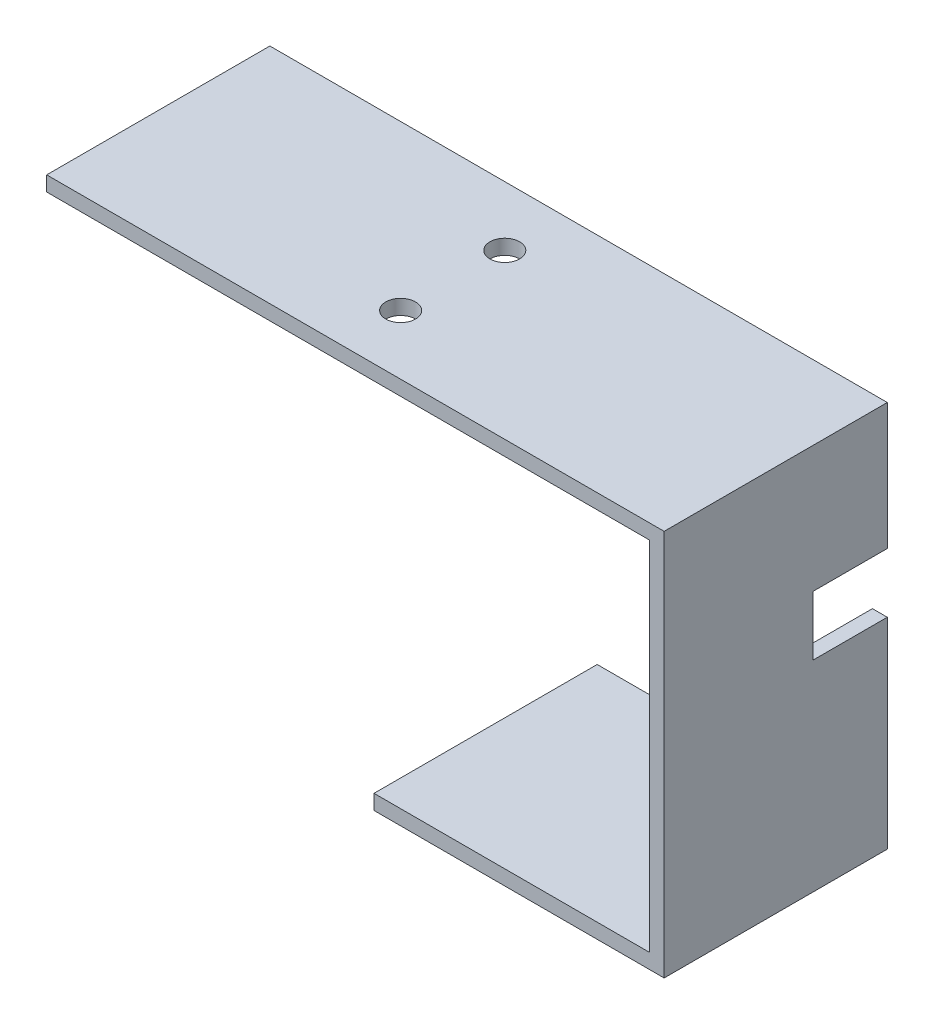
ISO-10303-21;
HEADER;
FILE_DESCRIPTION(('STEP AP214'),'2;1');
FILE_NAME('part.step','',(''),(''),'','','');
FILE_SCHEMA(('AUTOMOTIVE_DESIGN { 1 0 10303 214 1 1 1 1 }'));
ENDSEC;
DATA;
#1=APPLICATION_CONTEXT('core data for automotive mechanical design processes');
#2=APPLICATION_PROTOCOL_DEFINITION('international standard','automotive_design',2000,#1);
#3=PRODUCT_CONTEXT('',#1,'mechanical');
#4=PRODUCT('Part','Part','',(#3));
#5=PRODUCT_RELATED_PRODUCT_CATEGORY('part','',(#4));
#6=PRODUCT_DEFINITION_FORMATION('','',#4);
#7=PRODUCT_DEFINITION_CONTEXT('part definition',#1,'design');
#8=PRODUCT_DEFINITION('design','',#6,#7);
#9=PRODUCT_DEFINITION_SHAPE('','',#8);
#10=(LENGTH_UNIT() NAMED_UNIT(*) SI_UNIT(.MILLI.,.METRE.));
#11=(NAMED_UNIT(*) PLANE_ANGLE_UNIT() SI_UNIT($,.RADIAN.));
#12=(NAMED_UNIT(*) SI_UNIT($,.STERADIAN.) SOLID_ANGLE_UNIT());
#13=UNCERTAINTY_MEASURE_WITH_UNIT(LENGTH_MEASURE(1.E-05),#10,'distance_accuracy_value','');
#14=(GEOMETRIC_REPRESENTATION_CONTEXT(3) GLOBAL_UNCERTAINTY_ASSIGNED_CONTEXT((#13)) GLOBAL_UNIT_ASSIGNED_CONTEXT((#10,
#11,#12)) REPRESENTATION_CONTEXT('',''));
#15=CARTESIAN_POINT('',(0.,0.,0.));
#16=DIRECTION('',(0.,0.,1.));
#17=DIRECTION('',(1.,0.,0.));
#18=AXIS2_PLACEMENT_3D('',#15,#16,#17);
#19=CARTESIAN_POINT('',(0.,0.,0.));
#20=DIRECTION('',(0.,0.,-1.));
#21=DIRECTION('',(-1.,0.,0.));
#22=AXIS2_PLACEMENT_3D('',#19,#20,#21);
#23=PLANE('',#22);
#24=DIRECTION('',(-1.,0.,0.));
#25=VECTOR('',#24,1.);
#26=CARTESIAN_POINT('',(0.,-23.,0.));
#27=LINE('',#26,#25);
#28=CARTESIAN_POINT('',(2.,-23.,0.));
#29=VERTEX_POINT('',#28);
#30=CARTESIAN_POINT('',(0.,-23.,0.));
#31=VERTEX_POINT('',#30);
#32=EDGE_CURVE('E43',#29,#31,#27,.T.);
#33=ORIENTED_EDGE('',*,*,#32,.F.);
#34=DIRECTION('',(0.,-1.,0.));
#35=VECTOR('',#34,1.);
#36=CARTESIAN_POINT('',(2.,0.,0.));
#37=LINE('',#36,#35);
#38=CARTESIAN_POINT('',(2.00000000000001,-50.,0.));
#39=VERTEX_POINT('',#38);
#40=EDGE_CURVE('E157',#29,#39,#37,.T.);
#41=ORIENTED_EDGE('',*,*,#40,.T.);
#42=DIRECTION('',(-1.,0.,0.));
#43=VECTOR('',#42,1.);
#44=CARTESIAN_POINT('',(0.,-50.,0.));
#45=LINE('',#44,#43);
#46=CARTESIAN_POINT('',(-37.,-50.,0.));
#47=VERTEX_POINT('',#46);
#48=EDGE_CURVE('E154',#39,#47,#45,.T.);
#49=ORIENTED_EDGE('',*,*,#48,.T.);
#50=DIRECTION('',(0.,1.,0.));
#51=VECTOR('',#50,1.);
#52=CARTESIAN_POINT('',(-37.,-50.,0.));
#53=LINE('',#52,#51);
#54=CARTESIAN_POINT('',(-37.,-48.,0.));
#55=VERTEX_POINT('',#54);
#56=EDGE_CURVE('E150',#47,#55,#53,.T.);
#57=ORIENTED_EDGE('',*,*,#56,.T.);
#58=DIRECTION('',(-1.,0.,0.));
#59=VECTOR('',#58,1.);
#60=CARTESIAN_POINT('',(0.,-48.,0.));
#61=LINE('',#60,#59);
#62=CARTESIAN_POINT('',(0.,-48.,0.));
#63=VERTEX_POINT('',#62);
#64=EDGE_CURVE('E147',#63,#55,#61,.T.);
#65=ORIENTED_EDGE('',*,*,#64,.F.);
#66=DIRECTION('',(0.,-1.,0.));
#67=VECTOR('',#66,1.);
#68=CARTESIAN_POINT('',(0.,0.,0.));
#69=LINE('',#68,#67);
#70=EDGE_CURVE('E93',#31,#63,#69,.T.);
#71=ORIENTED_EDGE('',*,*,#70,.F.);
#72=EDGE_LOOP('',(#33,#41,#49,#57,#65,#71));
#73=FACE_BOUND('',#72,.T.);
#74=ADVANCED_FACE('F34',(#73),#23,.T.);
#75=CARTESIAN_POINT('',(0.,-48.,30.));
#76=DIRECTION('',(0.,-1.,0.));
#77=DIRECTION('',(1.,0.,0.));
#78=AXIS2_PLACEMENT_3D('',#75,#76,#77);
#79=PLANE('',#78);
#80=ORIENTED_EDGE('',*,*,#64,.T.);
#81=DIRECTION('',(0.,0.,-1.));
#82=VECTOR('',#81,1.);
#83=CARTESIAN_POINT('',(-37.,-48.,30.));
#84=LINE('',#83,#82);
#85=CARTESIAN_POINT('',(-37.,-48.,30.));
#86=VERTEX_POINT('',#85);
#87=EDGE_CURVE('E180',#86,#55,#84,.T.);
#88=ORIENTED_EDGE('',*,*,#87,.F.);
#89=DIRECTION('',(-1.,0.,0.));
#90=VECTOR('',#89,1.);
#91=CARTESIAN_POINT('',(0.,-48.,30.));
#92=LINE('',#91,#90);
#93=CARTESIAN_POINT('',(0.,-48.,30.));
#94=VERTEX_POINT('',#93);
#95=EDGE_CURVE('E99',#94,#86,#92,.T.);
#96=ORIENTED_EDGE('',*,*,#95,.F.);
#97=DIRECTION('',(0.,0.,-1.));
#98=VECTOR('',#97,1.);
#99=CARTESIAN_POINT('',(0.,-48.,30.));
#100=LINE('',#99,#98);
#101=EDGE_CURVE('E146',#94,#63,#100,.T.);
#102=ORIENTED_EDGE('',*,*,#101,.T.);
#103=EDGE_LOOP('',(#80,#88,#96,#102));
#104=FACE_BOUND('',#103,.T.);
#105=ADVANCED_FACE('F36',(#104),#79,.F.);
#106=CARTESIAN_POINT('',(-37.,-50.,30.));
#107=DIRECTION('',(-1.,0.,0.));
#108=DIRECTION('',(0.,0.,1.));
#109=AXIS2_PLACEMENT_3D('',#106,#107,#108);
#110=PLANE('',#109);
#111=ORIENTED_EDGE('',*,*,#56,.F.);
#112=DIRECTION('',(0.,0.,-1.));
#113=VECTOR('',#112,1.);
#114=CARTESIAN_POINT('',(-37.,-50.,30.));
#115=LINE('',#114,#113);
#116=CARTESIAN_POINT('',(-37.,-50.,30.));
#117=VERTEX_POINT('',#116);
#118=EDGE_CURVE('E178',#117,#47,#115,.T.);
#119=ORIENTED_EDGE('',*,*,#118,.F.);
#120=DIRECTION('',(0.,1.,0.));
#121=VECTOR('',#120,1.);
#122=CARTESIAN_POINT('',(-37.,-50.,30.));
#123=LINE('',#122,#121);
#124=EDGE_CURVE('E216',#117,#86,#123,.T.);
#125=ORIENTED_EDGE('',*,*,#124,.T.);
#126=ORIENTED_EDGE('',*,*,#87,.T.);
#127=EDGE_LOOP('',(#111,#119,#125,#126));
#128=FACE_BOUND('',#127,.T.);
#129=ADVANCED_FACE('F240',(#128),#110,.T.);
#130=CARTESIAN_POINT('',(0.,-50.,30.));
#131=DIRECTION('',(0.,-1.,0.));
#132=DIRECTION('',(1.,0.,0.));
#133=AXIS2_PLACEMENT_3D('',#130,#131,#132);
#134=PLANE('',#133);
#135=ORIENTED_EDGE('',*,*,#48,.F.);
#136=DIRECTION('',(0.,0.,-1.));
#137=VECTOR('',#136,1.);
#138=CARTESIAN_POINT('',(2.00000000000001,-50.,30.));
#139=LINE('',#138,#137);
#140=CARTESIAN_POINT('',(2.00000000000001,-50.,30.));
#141=VERTEX_POINT('',#140);
#142=EDGE_CURVE('E175',#141,#39,#139,.T.);
#143=ORIENTED_EDGE('',*,*,#142,.F.);
#144=DIRECTION('',(-1.,0.,0.));
#145=VECTOR('',#144,1.);
#146=CARTESIAN_POINT('',(0.,-50.,30.));
#147=LINE('',#146,#145);
#148=EDGE_CURVE('E219',#141,#117,#147,.T.);
#149=ORIENTED_EDGE('',*,*,#148,.T.);
#150=ORIENTED_EDGE('',*,*,#118,.T.);
#151=EDGE_LOOP('',(#135,#143,#149,#150));
#152=FACE_BOUND('',#151,.T.);
#153=ADVANCED_FACE('F242',(#152),#134,.T.);
#154=CARTESIAN_POINT('',(2.,0.,30.));
#155=DIRECTION('',(1.,0.,0.));
#156=DIRECTION('',(0.,1.,0.));
#157=AXIS2_PLACEMENT_3D('',#154,#155,#156);
#158=PLANE('',#157);
#159=DIRECTION('',(0.,0.,-1.));
#160=VECTOR('',#159,1.);
#161=CARTESIAN_POINT('',(2.,-23.,0.));
#162=LINE('',#161,#160);
#163=CARTESIAN_POINT('',(2.,-23.,10.));
#164=VERTEX_POINT('',#163);
#165=EDGE_CURVE('E204',#164,#29,#162,.T.);
#166=ORIENTED_EDGE('',*,*,#165,.F.);
#167=DIRECTION('',(0.,-1.,0.));
#168=VECTOR('',#167,1.);
#169=CARTESIAN_POINT('',(2.,-23.,10.));
#170=LINE('',#169,#168);
#171=CARTESIAN_POINT('',(2.,-15.,10.));
#172=VERTEX_POINT('',#171);
#173=EDGE_CURVE('E192',#172,#164,#170,.T.);
#174=ORIENTED_EDGE('',*,*,#173,.F.);
#175=DIRECTION('',(0.,0.,1.));
#176=VECTOR('',#175,1.);
#177=CARTESIAN_POINT('',(2.,-15.,10.));
#178=LINE('',#177,#176);
#179=CARTESIAN_POINT('',(2.,-15.,0.));
#180=VERTEX_POINT('',#179);
#181=EDGE_CURVE('E187',#180,#172,#178,.T.);
#182=ORIENTED_EDGE('',*,*,#181,.F.);
#183=CARTESIAN_POINT('',(2.,2.,0.));
#184=VERTEX_POINT('',#183);
#185=EDGE_CURVE('E158',#184,#180,#37,.T.);
#186=ORIENTED_EDGE('',*,*,#185,.F.);
#187=DIRECTION('',(0.,0.,-1.));
#188=VECTOR('',#187,1.);
#189=CARTESIAN_POINT('',(2.,2.,30.));
#190=LINE('',#189,#188);
#191=CARTESIAN_POINT('',(2.,2.,30.));
#192=VERTEX_POINT('',#191);
#193=EDGE_CURVE('E173',#192,#184,#190,.T.);
#194=ORIENTED_EDGE('',*,*,#193,.F.);
#195=DIRECTION('',(0.,-1.,0.));
#196=VECTOR('',#195,1.);
#197=CARTESIAN_POINT('',(2.,0.,30.));
#198=LINE('',#197,#196);
#199=EDGE_CURVE('E141',#192,#141,#198,.T.);
#200=ORIENTED_EDGE('',*,*,#199,.T.);
#201=ORIENTED_EDGE('',*,*,#142,.T.);
#202=ORIENTED_EDGE('',*,*,#40,.F.);
#203=EDGE_LOOP('',(#166,#174,#182,#186,#194,#200,#201,#202));
#204=FACE_BOUND('',#203,.T.);
#205=ADVANCED_FACE('F224',(#204),#158,.T.);
#206=CARTESIAN_POINT('',(-81.,2.,30.));
#207=DIRECTION('',(0.,1.,0.));
#208=DIRECTION('',(0.,0.,1.));
#209=AXIS2_PLACEMENT_3D('',#206,#207,#208);
#210=PLANE('',#209);
#211=CARTESIAN_POINT('',(-41.4201648339209,2.,22.));
#212=DIRECTION('',(0.,1.,0.));
#213=DIRECTION('',(0.,0.,1.));
#214=AXIS2_PLACEMENT_3D('',#211,#212,#213);
#215=CIRCLE('',#214,2.);
#216=CARTESIAN_POINT('',(-41.4201648339209,2.,24.));
#217=VERTEX_POINT('',#216);
#218=EDGE_CURVE('E199',#217,#217,#215,.T.);
#219=ORIENTED_EDGE('',*,*,#218,.F.);
#220=EDGE_LOOP('',(#219));
#221=FACE_BOUND('',#220,.T.);
#222=CARTESIAN_POINT('',(-41.4201648339209,2.,8.));
#223=DIRECTION('',(0.,1.,0.));
#224=DIRECTION('',(0.,0.,1.));
#225=AXIS2_PLACEMENT_3D('',#222,#223,#224);
#226=CIRCLE('',#225,2.);
#227=CARTESIAN_POINT('',(-41.4201648339209,2.,10.));
#228=VERTEX_POINT('',#227);
#229=EDGE_CURVE('E188',#228,#228,#226,.T.);
#230=ORIENTED_EDGE('',*,*,#229,.F.);
#231=EDGE_LOOP('',(#230));
#232=FACE_BOUND('',#231,.T.);
#233=DIRECTION('',(1.,0.,0.));
#234=VECTOR('',#233,1.);
#235=CARTESIAN_POINT('',(-81.,2.,0.));
#236=LINE('',#235,#234);
#237=CARTESIAN_POINT('',(-81.,2.,0.));
#238=VERTEX_POINT('',#237);
#239=EDGE_CURVE('E161',#238,#184,#236,.T.);
#240=ORIENTED_EDGE('',*,*,#239,.F.);
#241=DIRECTION('',(0.,0.,-1.));
#242=VECTOR('',#241,1.);
#243=CARTESIAN_POINT('',(-81.,2.,30.));
#244=LINE('',#243,#242);
#245=CARTESIAN_POINT('',(-81.,2.,30.));
#246=VERTEX_POINT('',#245);
#247=EDGE_CURVE('E127',#246,#238,#244,.T.);
#248=ORIENTED_EDGE('',*,*,#247,.F.);
#249=DIRECTION('',(1.,0.,0.));
#250=VECTOR('',#249,1.);
#251=CARTESIAN_POINT('',(-81.,2.,30.));
#252=LINE('',#251,#250);
#253=EDGE_CURVE('E139',#246,#192,#252,.T.);
#254=ORIENTED_EDGE('',*,*,#253,.T.);
#255=ORIENTED_EDGE('',*,*,#193,.T.);
#256=EDGE_LOOP('',(#240,#248,#254,#255));
#257=FACE_BOUND('',#256,.T.);
#258=ADVANCED_FACE('F231',(#221,#232,#257),#210,.T.);
#259=CARTESIAN_POINT('',(-81.,0.,30.));
#260=DIRECTION('',(-1.,0.,0.));
#261=DIRECTION('',(0.,0.,1.));
#262=AXIS2_PLACEMENT_3D('',#259,#260,#261);
#263=PLANE('',#262);
#264=DIRECTION('',(0.,1.,0.));
#265=VECTOR('',#264,1.);
#266=CARTESIAN_POINT('',(-81.,0.,0.));
#267=LINE('',#266,#265);
#268=CARTESIAN_POINT('',(-81.,0.,0.));
#269=VERTEX_POINT('',#268);
#270=EDGE_CURVE('E124',#269,#238,#267,.T.);
#271=ORIENTED_EDGE('',*,*,#270,.F.);
#272=DIRECTION('',(0.,0.,-1.));
#273=VECTOR('',#272,1.);
#274=CARTESIAN_POINT('',(-81.,0.,30.));
#275=LINE('',#274,#273);
#276=CARTESIAN_POINT('',(-81.,0.,30.));
#277=VERTEX_POINT('',#276);
#278=EDGE_CURVE('E118',#277,#269,#275,.T.);
#279=ORIENTED_EDGE('',*,*,#278,.F.);
#280=DIRECTION('',(0.,1.,0.));
#281=VECTOR('',#280,1.);
#282=CARTESIAN_POINT('',(-81.,0.,30.));
#283=LINE('',#282,#281);
#284=EDGE_CURVE('E122',#277,#246,#283,.T.);
#285=ORIENTED_EDGE('',*,*,#284,.T.);
#286=ORIENTED_EDGE('',*,*,#247,.T.);
#287=EDGE_LOOP('',(#271,#279,#285,#286));
#288=FACE_BOUND('',#287,.T.);
#289=ADVANCED_FACE('F120',(#288),#263,.T.);
#290=CARTESIAN_POINT('',(-81.,0.,30.));
#291=DIRECTION('',(0.,1.,0.));
#292=DIRECTION('',(0.,0.,1.));
#293=AXIS2_PLACEMENT_3D('',#290,#291,#292);
#294=PLANE('',#293);
#295=CARTESIAN_POINT('',(-41.4201648339209,0.,22.));
#296=DIRECTION('',(0.,1.,0.));
#297=DIRECTION('',(0.,0.,1.));
#298=AXIS2_PLACEMENT_3D('',#295,#296,#297);
#299=CIRCLE('',#298,2.);
#300=CARTESIAN_POINT('',(-41.4201648339209,0.,24.));
#301=VERTEX_POINT('',#300);
#302=EDGE_CURVE('E38',#301,#301,#299,.T.);
#303=ORIENTED_EDGE('',*,*,#302,.T.);
#304=EDGE_LOOP('',(#303));
#305=FACE_BOUND('',#304,.T.);
#306=CARTESIAN_POINT('',(-41.4201648339209,0.,8.));
#307=DIRECTION('',(0.,1.,0.));
#308=DIRECTION('',(0.,0.,1.));
#309=AXIS2_PLACEMENT_3D('',#306,#307,#308);
#310=CIRCLE('',#309,2.);
#311=CARTESIAN_POINT('',(-41.4201648339209,0.,10.));
#312=VERTEX_POINT('',#311);
#313=EDGE_CURVE('E185',#312,#312,#310,.T.);
#314=ORIENTED_EDGE('',*,*,#313,.T.);
#315=EDGE_LOOP('',(#314));
#316=FACE_BOUND('',#315,.T.);
#317=DIRECTION('',(1.,0.,0.));
#318=VECTOR('',#317,1.);
#319=CARTESIAN_POINT('',(-81.,0.,0.));
#320=LINE('',#319,#318);
#321=CARTESIAN_POINT('',(0.,0.,0.));
#322=VERTEX_POINT('',#321);
#323=EDGE_CURVE('E165',#269,#322,#320,.T.);
#324=ORIENTED_EDGE('',*,*,#323,.T.);
#325=DIRECTION('',(0.,0.,-1.));
#326=VECTOR('',#325,1.);
#327=CARTESIAN_POINT('',(0.,0.,30.));
#328=LINE('',#327,#326);
#329=CARTESIAN_POINT('',(0.,0.,30.));
#330=VERTEX_POINT('',#329);
#331=EDGE_CURVE('E128',#330,#322,#328,.T.);
#332=ORIENTED_EDGE('',*,*,#331,.F.);
#333=DIRECTION('',(1.,0.,0.));
#334=VECTOR('',#333,1.);
#335=CARTESIAN_POINT('',(-81.,0.,30.));
#336=LINE('',#335,#334);
#337=EDGE_CURVE('E131',#277,#330,#336,.T.);
#338=ORIENTED_EDGE('',*,*,#337,.F.);
#339=ORIENTED_EDGE('',*,*,#278,.T.);
#340=EDGE_LOOP('',(#324,#332,#338,#339));
#341=FACE_BOUND('',#340,.T.);
#342=ADVANCED_FACE('F132',(#305,#316,#341),#294,.F.);
#343=CARTESIAN_POINT('',(0.,0.,30.));
#344=DIRECTION('',(1.,0.,0.));
#345=DIRECTION('',(0.,1.,0.));
#346=AXIS2_PLACEMENT_3D('',#343,#344,#345);
#347=PLANE('',#346);
#348=DIRECTION('',(0.,-1.,0.));
#349=VECTOR('',#348,1.);
#350=CARTESIAN_POINT('',(0.,0.,10.));
#351=LINE('',#350,#349);
#352=CARTESIAN_POINT('',(0.,-15.,10.));
#353=VERTEX_POINT('',#352);
#354=CARTESIAN_POINT('',(0.,-23.,10.));
#355=VERTEX_POINT('',#354);
#356=EDGE_CURVE('E11',#353,#355,#351,.T.);
#357=ORIENTED_EDGE('',*,*,#356,.T.);
#358=DIRECTION('',(0.,0.,-1.));
#359=VECTOR('',#358,1.);
#360=CARTESIAN_POINT('',(0.,-23.,30.));
#361=LINE('',#360,#359);
#362=EDGE_CURVE('E151',#355,#31,#361,.T.);
#363=ORIENTED_EDGE('',*,*,#362,.T.);
#364=ORIENTED_EDGE('',*,*,#70,.T.);
#365=ORIENTED_EDGE('',*,*,#101,.F.);
#366=DIRECTION('',(0.,-1.,0.));
#367=VECTOR('',#366,1.);
#368=CARTESIAN_POINT('',(0.,0.,30.));
#369=LINE('',#368,#367);
#370=EDGE_CURVE('E60',#330,#94,#369,.T.);
#371=ORIENTED_EDGE('',*,*,#370,.F.);
#372=ORIENTED_EDGE('',*,*,#331,.T.);
#373=CARTESIAN_POINT('',(0.,-15.,0.));
#374=VERTEX_POINT('',#373);
#375=EDGE_CURVE('E167',#322,#374,#69,.T.);
#376=ORIENTED_EDGE('',*,*,#375,.T.);
#377=DIRECTION('',(0.,0.,1.));
#378=VECTOR('',#377,1.);
#379=CARTESIAN_POINT('',(0.,-15.,30.));
#380=LINE('',#379,#378);
#381=EDGE_CURVE('E51',#374,#353,#380,.T.);
#382=ORIENTED_EDGE('',*,*,#381,.T.);
#383=EDGE_LOOP('',(#357,#363,#364,#365,#371,#372,#376,#382));
#384=FACE_BOUND('',#383,.T.);
#385=ADVANCED_FACE('F235',(#384),#347,.F.);
#386=CARTESIAN_POINT('',(0.,0.,30.));
#387=DIRECTION('',(0.,0.,-1.));
#388=DIRECTION('',(-1.,0.,0.));
#389=AXIS2_PLACEMENT_3D('',#386,#387,#388);
#390=PLANE('',#389);
#391=ORIENTED_EDGE('',*,*,#95,.T.);
#392=ORIENTED_EDGE('',*,*,#124,.F.);
#393=ORIENTED_EDGE('',*,*,#148,.F.);
#394=ORIENTED_EDGE('',*,*,#199,.F.);
#395=ORIENTED_EDGE('',*,*,#253,.F.);
#396=ORIENTED_EDGE('',*,*,#284,.F.);
#397=ORIENTED_EDGE('',*,*,#337,.T.);
#398=ORIENTED_EDGE('',*,*,#370,.T.);
#399=EDGE_LOOP('',(#391,#392,#393,#394,#395,#396,#397,#398));
#400=FACE_BOUND('',#399,.T.);
#401=ADVANCED_FACE('F136',(#400),#390,.F.);
#402=DIRECTION('',(1.,0.,0.));
#403=VECTOR('',#402,1.);
#404=CARTESIAN_POINT('',(0.,-15.,0.));
#405=LINE('',#404,#403);
#406=EDGE_CURVE('E182',#374,#180,#405,.T.);
#407=ORIENTED_EDGE('',*,*,#406,.F.);
#408=ORIENTED_EDGE('',*,*,#375,.F.);
#409=ORIENTED_EDGE('',*,*,#323,.F.);
#410=ORIENTED_EDGE('',*,*,#270,.T.);
#411=ORIENTED_EDGE('',*,*,#239,.T.);
#412=ORIENTED_EDGE('',*,*,#185,.T.);
#413=EDGE_LOOP('',(#407,#408,#409,#410,#411,#412));
#414=FACE_BOUND('',#413,.T.);
#415=ADVANCED_FACE('F233',(#414),#23,.T.);
#416=CARTESIAN_POINT('',(-28.,-23.,10.));
#417=DIRECTION('',(0.,0.,1.));
#418=DIRECTION('',(1.,0.,0.));
#419=AXIS2_PLACEMENT_3D('',#416,#417,#418);
#420=PLANE('',#419);
#421=DIRECTION('',(1.,0.,0.));
#422=VECTOR('',#421,1.);
#423=CARTESIAN_POINT('',(-28.,-15.,10.));
#424=LINE('',#423,#422);
#425=EDGE_CURVE('E207',#353,#172,#424,.T.);
#426=ORIENTED_EDGE('',*,*,#425,.T.);
#427=ORIENTED_EDGE('',*,*,#173,.T.);
#428=DIRECTION('',(1.,0.,0.));
#429=VECTOR('',#428,1.);
#430=CARTESIAN_POINT('',(-28.,-23.,10.));
#431=LINE('',#430,#429);
#432=EDGE_CURVE('E208',#355,#164,#431,.T.);
#433=ORIENTED_EDGE('',*,*,#432,.F.);
#434=ORIENTED_EDGE('',*,*,#356,.F.);
#435=EDGE_LOOP('',(#426,#427,#433,#434));
#436=FACE_BOUND('',#435,.T.);
#437=ADVANCED_FACE('F261',(#436),#420,.F.);
#438=CARTESIAN_POINT('',(-28.,-23.,0.));
#439=DIRECTION('',(0.,-1.,0.));
#440=DIRECTION('',(1.,0.,0.));
#441=AXIS2_PLACEMENT_3D('',#438,#439,#440);
#442=PLANE('',#441);
#443=ORIENTED_EDGE('',*,*,#432,.T.);
#444=ORIENTED_EDGE('',*,*,#165,.T.);
#445=ORIENTED_EDGE('',*,*,#32,.T.);
#446=ORIENTED_EDGE('',*,*,#362,.F.);
#447=EDGE_LOOP('',(#443,#444,#445,#446));
#448=FACE_BOUND('',#447,.T.);
#449=ADVANCED_FACE('F259',(#448),#442,.F.);
#450=CARTESIAN_POINT('',(-28.,-15.,10.));
#451=DIRECTION('',(0.,1.,0.));
#452=DIRECTION('',(-1.,0.,0.));
#453=AXIS2_PLACEMENT_3D('',#450,#451,#452);
#454=PLANE('',#453);
#455=ORIENTED_EDGE('',*,*,#406,.T.);
#456=ORIENTED_EDGE('',*,*,#181,.T.);
#457=ORIENTED_EDGE('',*,*,#425,.F.);
#458=ORIENTED_EDGE('',*,*,#381,.F.);
#459=EDGE_LOOP('',(#455,#456,#457,#458));
#460=FACE_BOUND('',#459,.T.);
#461=ADVANCED_FACE('F262',(#460),#454,.F.);
#462=CARTESIAN_POINT('',(-41.4201648339209,-8.,8.));
#463=DIRECTION('',(0.,1.,0.));
#464=DIRECTION('',(0.,0.,1.));
#465=AXIS2_PLACEMENT_3D('',#462,#463,#464);
#466=CYLINDRICAL_SURFACE('',#465,2.);
#467=ORIENTED_EDGE('',*,*,#229,.T.);
#468=EDGE_LOOP('',(#467));
#469=FACE_BOUND('',#468,.T.);
#470=ORIENTED_EDGE('',*,*,#313,.F.);
#471=EDGE_LOOP('',(#470));
#472=FACE_BOUND('',#471,.T.);
#473=ADVANCED_FACE('F267',(#469,#472),#466,.F.);
#474=CARTESIAN_POINT('',(-41.4201648339209,-8.,22.));
#475=DIRECTION('',(0.,1.,0.));
#476=DIRECTION('',(0.,0.,1.));
#477=AXIS2_PLACEMENT_3D('',#474,#475,#476);
#478=CYLINDRICAL_SURFACE('',#477,2.);
#479=ORIENTED_EDGE('',*,*,#218,.T.);
#480=EDGE_LOOP('',(#479));
#481=FACE_BOUND('',#480,.T.);
#482=ORIENTED_EDGE('',*,*,#302,.F.);
#483=EDGE_LOOP('',(#482));
#484=FACE_BOUND('',#483,.T.);
#485=ADVANCED_FACE('F273',(#481,#484),#478,.F.);
#486=CLOSED_SHELL('',(#74,#105,#129,#153,#205,#258,#289,#342,#385,#401,#415,#437,#449,#461,#473,#485));
#487=MANIFOLD_SOLID_BREP('B2',#486);
#488=ADVANCED_BREP_SHAPE_REPRESENTATION('',(#18,#487),#14);
#489=SHAPE_DEFINITION_REPRESENTATION(#9,#488);
ENDSEC;
END-ISO-10303-21;
